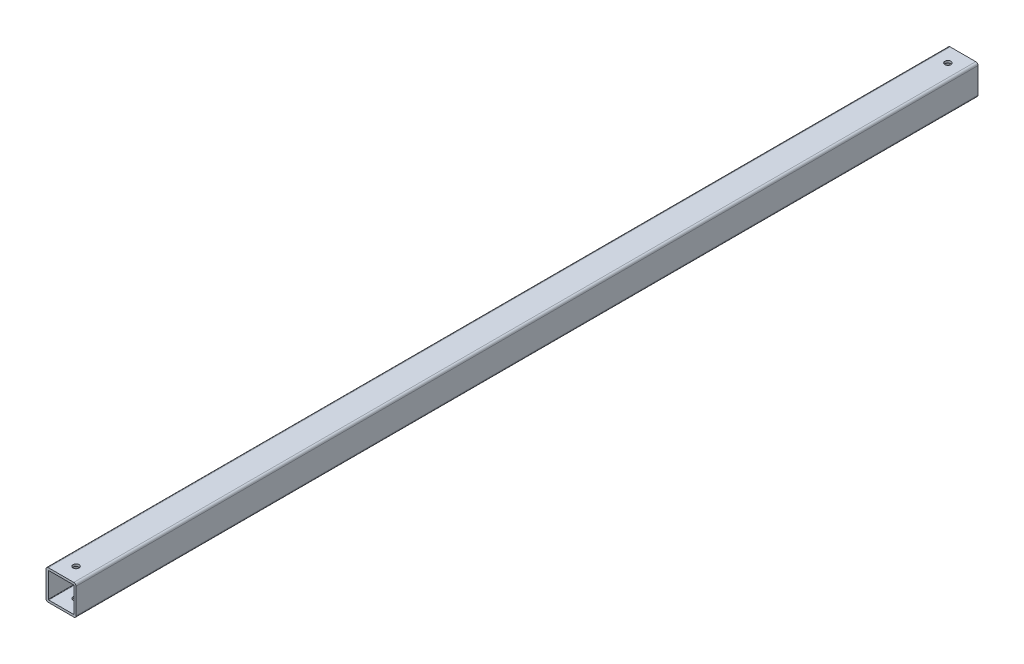
ISO-10303-21;
HEADER;
FILE_DESCRIPTION(('STEP AP214'),'2;1');
FILE_NAME('part.step','',(''),(''),'','','');
FILE_SCHEMA(('AUTOMOTIVE_DESIGN { 1 0 10303 214 1 1 1 1 }'));
ENDSEC;
DATA;
#1=APPLICATION_CONTEXT('core data for automotive mechanical design processes');
#2=APPLICATION_PROTOCOL_DEFINITION('international standard','automotive_design',2000,#1);
#3=PRODUCT_CONTEXT('',#1,'mechanical');
#4=PRODUCT('Part','Part','',(#3));
#5=PRODUCT_RELATED_PRODUCT_CATEGORY('part','',(#4));
#6=PRODUCT_DEFINITION_FORMATION('','',#4);
#7=PRODUCT_DEFINITION_CONTEXT('part definition',#1,'design');
#8=PRODUCT_DEFINITION('design','',#6,#7);
#9=PRODUCT_DEFINITION_SHAPE('','',#8);
#10=(LENGTH_UNIT() NAMED_UNIT(*) SI_UNIT(.MILLI.,.METRE.));
#11=(NAMED_UNIT(*) PLANE_ANGLE_UNIT() SI_UNIT($,.RADIAN.));
#12=(NAMED_UNIT(*) SI_UNIT($,.STERADIAN.) SOLID_ANGLE_UNIT());
#13=UNCERTAINTY_MEASURE_WITH_UNIT(LENGTH_MEASURE(1.E-05),#10,'distance_accuracy_value','');
#14=(GEOMETRIC_REPRESENTATION_CONTEXT(3) GLOBAL_UNCERTAINTY_ASSIGNED_CONTEXT((#13)) GLOBAL_UNIT_ASSIGNED_CONTEXT((#10,
#11,#12)) REPRESENTATION_CONTEXT('',''));
#15=CARTESIAN_POINT('',(0.,0.,0.));
#16=DIRECTION('',(0.,0.,1.));
#17=DIRECTION('',(1.,0.,0.));
#18=AXIS2_PLACEMENT_3D('',#15,#16,#17);
#19=CARTESIAN_POINT('',(0.,0.,1200.));
#20=DIRECTION('',(0.,0.,1.));
#21=DIRECTION('',(1.,0.,0.));
#22=AXIS2_PLACEMENT_3D('',#19,#20,#21);
#23=PLANE('',#22);
#24=DIRECTION('',(1.,0.,0.));
#25=VECTOR('',#24,1.);
#26=CARTESIAN_POINT('',(-20.,-20.,1200.));
#27=LINE('',#26,#25);
#28=CARTESIAN_POINT('',(-17.,-20.,1200.));
#29=VERTEX_POINT('',#28);
#30=CARTESIAN_POINT('',(17.,-20.,1200.));
#31=VERTEX_POINT('',#30);
#32=EDGE_CURVE('E199',#29,#31,#27,.T.);
#33=ORIENTED_EDGE('',*,*,#32,.T.);
#34=CARTESIAN_POINT('',(17.,-17.,1200.));
#35=DIRECTION('',(0.,0.,1.));
#36=DIRECTION('',(1.,0.,0.));
#37=AXIS2_PLACEMENT_3D('',#34,#35,#36);
#38=CIRCLE('',#37,3.);
#39=CARTESIAN_POINT('',(20.,-17.,1200.));
#40=VERTEX_POINT('',#39);
#41=EDGE_CURVE('E258',#31,#40,#38,.T.);
#42=ORIENTED_EDGE('',*,*,#41,.T.);
#43=DIRECTION('',(0.,1.,0.));
#44=VECTOR('',#43,1.);
#45=CARTESIAN_POINT('',(20.,20.,1200.));
#46=LINE('',#45,#44);
#47=CARTESIAN_POINT('',(20.,17.,1200.));
#48=VERTEX_POINT('',#47);
#49=EDGE_CURVE('E299',#40,#48,#46,.T.);
#50=ORIENTED_EDGE('',*,*,#49,.T.);
#51=CARTESIAN_POINT('',(17.,17.,1200.));
#52=DIRECTION('',(0.,0.,1.));
#53=DIRECTION('',(1.,0.,0.));
#54=AXIS2_PLACEMENT_3D('',#51,#52,#53);
#55=CIRCLE('',#54,3.);
#56=CARTESIAN_POINT('',(17.,20.,1200.));
#57=VERTEX_POINT('',#56);
#58=EDGE_CURVE('E254',#48,#57,#55,.T.);
#59=ORIENTED_EDGE('',*,*,#58,.T.);
#60=DIRECTION('',(-1.,0.,0.));
#61=VECTOR('',#60,1.);
#62=CARTESIAN_POINT('',(-20.,20.,1200.));
#63=LINE('',#62,#61);
#64=CARTESIAN_POINT('',(-17.,20.,1200.));
#65=VERTEX_POINT('',#64);
#66=EDGE_CURVE('E302',#57,#65,#63,.T.);
#67=ORIENTED_EDGE('',*,*,#66,.T.);
#68=CARTESIAN_POINT('',(-17.,17.,1200.));
#69=DIRECTION('',(0.,0.,1.));
#70=DIRECTION('',(1.,0.,0.));
#71=AXIS2_PLACEMENT_3D('',#68,#69,#70);
#72=CIRCLE('',#71,3.);
#73=CARTESIAN_POINT('',(-20.,17.,1200.));
#74=VERTEX_POINT('',#73);
#75=EDGE_CURVE('E80',#65,#74,#72,.T.);
#76=ORIENTED_EDGE('',*,*,#75,.T.);
#77=DIRECTION('',(0.,-1.,0.));
#78=VECTOR('',#77,1.);
#79=CARTESIAN_POINT('',(-20.,20.,1200.));
#80=LINE('',#79,#78);
#81=CARTESIAN_POINT('',(-20.,-17.,1200.));
#82=VERTEX_POINT('',#81);
#83=EDGE_CURVE('E204',#74,#82,#80,.T.);
#84=ORIENTED_EDGE('',*,*,#83,.T.);
#85=CARTESIAN_POINT('',(-17.,-17.,1200.));
#86=DIRECTION('',(0.,0.,1.));
#87=DIRECTION('',(1.,0.,0.));
#88=AXIS2_PLACEMENT_3D('',#85,#86,#87);
#89=CIRCLE('',#88,3.);
#90=EDGE_CURVE('E256',#82,#29,#89,.T.);
#91=ORIENTED_EDGE('',*,*,#90,.T.);
#92=EDGE_LOOP('',(#33,#42,#50,#59,#67,#76,#84,#91));
#93=FACE_BOUND('',#92,.T.);
#94=DIRECTION('',(-1.,0.,0.));
#95=VECTOR('',#94,1.);
#96=CARTESIAN_POINT('',(-20.,17.,1200.));
#97=LINE('',#96,#95);
#98=CARTESIAN_POINT('',(16.5,17.,1200.));
#99=VERTEX_POINT('',#98);
#100=CARTESIAN_POINT('',(-16.5,17.,1200.));
#101=VERTEX_POINT('',#100);
#102=EDGE_CURVE('E286',#99,#101,#97,.T.);
#103=ORIENTED_EDGE('',*,*,#102,.F.);
#104=CARTESIAN_POINT('',(16.5,16.5,1200.));
#105=DIRECTION('',(0.,0.,1.));
#106=DIRECTION('',(1.,0.,0.));
#107=AXIS2_PLACEMENT_3D('',#104,#105,#106);
#108=CIRCLE('',#107,0.5);
#109=CARTESIAN_POINT('',(17.,16.5,1200.));
#110=VERTEX_POINT('',#109);
#111=EDGE_CURVE('E229',#99,#110,#108,.F.);
#112=ORIENTED_EDGE('',*,*,#111,.T.);
#113=DIRECTION('',(0.,1.,0.));
#114=VECTOR('',#113,1.);
#115=CARTESIAN_POINT('',(17.,20.,1200.));
#116=LINE('',#115,#114);
#117=CARTESIAN_POINT('',(17.,-16.5,1200.));
#118=VERTEX_POINT('',#117);
#119=EDGE_CURVE('E283',#118,#110,#116,.T.);
#120=ORIENTED_EDGE('',*,*,#119,.F.);
#121=CARTESIAN_POINT('',(16.5,-16.5,1200.));
#122=DIRECTION('',(0.,0.,1.));
#123=DIRECTION('',(1.,0.,0.));
#124=AXIS2_PLACEMENT_3D('',#121,#122,#123);
#125=CIRCLE('',#124,0.5);
#126=CARTESIAN_POINT('',(16.5,-17.,1200.));
#127=VERTEX_POINT('',#126);
#128=EDGE_CURVE('E233',#118,#127,#125,.F.);
#129=ORIENTED_EDGE('',*,*,#128,.T.);
#130=DIRECTION('',(1.,0.,0.));
#131=VECTOR('',#130,1.);
#132=CARTESIAN_POINT('',(-20.,-17.,1200.));
#133=LINE('',#132,#131);
#134=CARTESIAN_POINT('',(-16.5,-17.,1200.));
#135=VERTEX_POINT('',#134);
#136=EDGE_CURVE('E291',#135,#127,#133,.T.);
#137=ORIENTED_EDGE('',*,*,#136,.F.);
#138=CARTESIAN_POINT('',(-16.5,-16.5,1200.));
#139=DIRECTION('',(0.,0.,1.));
#140=DIRECTION('',(1.,0.,0.));
#141=AXIS2_PLACEMENT_3D('',#138,#139,#140);
#142=CIRCLE('',#141,0.5);
#143=CARTESIAN_POINT('',(-17.,-16.5,1200.));
#144=VERTEX_POINT('',#143);
#145=EDGE_CURVE('E185',#135,#144,#142,.F.);
#146=ORIENTED_EDGE('',*,*,#145,.T.);
#147=DIRECTION('',(0.,-1.,0.));
#148=VECTOR('',#147,1.);
#149=CARTESIAN_POINT('',(-17.,20.,1200.));
#150=LINE('',#149,#148);
#151=CARTESIAN_POINT('',(-17.,16.5,1200.));
#152=VERTEX_POINT('',#151);
#153=EDGE_CURVE('E289',#152,#144,#150,.T.);
#154=ORIENTED_EDGE('',*,*,#153,.F.);
#155=CARTESIAN_POINT('',(-16.5,16.5,1200.));
#156=DIRECTION('',(0.,0.,1.));
#157=DIRECTION('',(1.,0.,0.));
#158=AXIS2_PLACEMENT_3D('',#155,#156,#157);
#159=CIRCLE('',#158,0.5);
#160=EDGE_CURVE('E184',#152,#101,#159,.F.);
#161=ORIENTED_EDGE('',*,*,#160,.T.);
#162=EDGE_LOOP('',(#103,#112,#120,#129,#137,#146,#154,#161));
#163=FACE_BOUND('',#162,.T.);
#164=ADVANCED_FACE('F56',(#93,#163),#23,.T.);
#165=CARTESIAN_POINT('',(0.,0.,0.));
#166=DIRECTION('',(0.,0.,1.));
#167=DIRECTION('',(1.,0.,0.));
#168=AXIS2_PLACEMENT_3D('',#165,#166,#167);
#169=PLANE('',#168);
#170=DIRECTION('',(0.,1.,0.));
#171=VECTOR('',#170,1.);
#172=CARTESIAN_POINT('',(20.,20.,0.));
#173=LINE('',#172,#171);
#174=CARTESIAN_POINT('',(20.,-17.,0.));
#175=VERTEX_POINT('',#174);
#176=CARTESIAN_POINT('',(20.,17.,0.));
#177=VERTEX_POINT('',#176);
#178=EDGE_CURVE('E294',#175,#177,#173,.T.);
#179=ORIENTED_EDGE('',*,*,#178,.F.);
#180=CARTESIAN_POINT('',(17.,-17.,0.));
#181=DIRECTION('',(0.,0.,1.));
#182=DIRECTION('',(1.,0.,0.));
#183=AXIS2_PLACEMENT_3D('',#180,#181,#182);
#184=CIRCLE('',#183,3.);
#185=CARTESIAN_POINT('',(17.,-20.,0.));
#186=VERTEX_POINT('',#185);
#187=EDGE_CURVE('E246',#175,#186,#184,.F.);
#188=ORIENTED_EDGE('',*,*,#187,.T.);
#189=DIRECTION('',(1.,0.,0.));
#190=VECTOR('',#189,1.);
#191=CARTESIAN_POINT('',(-20.,-20.,0.));
#192=LINE('',#191,#190);
#193=CARTESIAN_POINT('',(-17.,-20.,0.));
#194=VERTEX_POINT('',#193);
#195=EDGE_CURVE('E207',#194,#186,#192,.T.);
#196=ORIENTED_EDGE('',*,*,#195,.F.);
#197=CARTESIAN_POINT('',(-17.,-17.,0.));
#198=DIRECTION('',(0.,0.,1.));
#199=DIRECTION('',(1.,0.,0.));
#200=AXIS2_PLACEMENT_3D('',#197,#198,#199);
#201=CIRCLE('',#200,3.);
#202=CARTESIAN_POINT('',(-20.,-17.,0.));
#203=VERTEX_POINT('',#202);
#204=EDGE_CURVE('E244',#194,#203,#201,.F.);
#205=ORIENTED_EDGE('',*,*,#204,.T.);
#206=DIRECTION('',(0.,-1.,0.));
#207=VECTOR('',#206,1.);
#208=CARTESIAN_POINT('',(-20.,20.,0.));
#209=LINE('',#208,#207);
#210=CARTESIAN_POINT('',(-20.,17.,0.));
#211=VERTEX_POINT('',#210);
#212=EDGE_CURVE('E309',#211,#203,#209,.T.);
#213=ORIENTED_EDGE('',*,*,#212,.F.);
#214=CARTESIAN_POINT('',(-17.,17.,0.));
#215=DIRECTION('',(0.,0.,1.));
#216=DIRECTION('',(1.,0.,0.));
#217=AXIS2_PLACEMENT_3D('',#214,#215,#216);
#218=CIRCLE('',#217,3.);
#219=CARTESIAN_POINT('',(-17.,20.,0.));
#220=VERTEX_POINT('',#219);
#221=EDGE_CURVE('E240',#211,#220,#218,.F.);
#222=ORIENTED_EDGE('',*,*,#221,.T.);
#223=DIRECTION('',(-1.,0.,0.));
#224=VECTOR('',#223,1.);
#225=CARTESIAN_POINT('',(-20.,20.,0.));
#226=LINE('',#225,#224);
#227=CARTESIAN_POINT('',(17.,20.,0.));
#228=VERTEX_POINT('',#227);
#229=EDGE_CURVE('E307',#228,#220,#226,.T.);
#230=ORIENTED_EDGE('',*,*,#229,.F.);
#231=CARTESIAN_POINT('',(17.,17.,0.));
#232=DIRECTION('',(0.,0.,1.));
#233=DIRECTION('',(1.,0.,0.));
#234=AXIS2_PLACEMENT_3D('',#231,#232,#233);
#235=CIRCLE('',#234,3.);
#236=EDGE_CURVE('E242',#228,#177,#235,.F.);
#237=ORIENTED_EDGE('',*,*,#236,.T.);
#238=EDGE_LOOP('',(#179,#188,#196,#205,#213,#222,#230,#237));
#239=FACE_BOUND('',#238,.T.);
#240=DIRECTION('',(1.,0.,0.));
#241=VECTOR('',#240,1.);
#242=CARTESIAN_POINT('',(-20.,-17.,0.));
#243=LINE('',#242,#241);
#244=CARTESIAN_POINT('',(-16.5,-17.,0.));
#245=VERTEX_POINT('',#244);
#246=CARTESIAN_POINT('',(16.5,-17.,0.));
#247=VERTEX_POINT('',#246);
#248=EDGE_CURVE('E195',#245,#247,#243,.T.);
#249=ORIENTED_EDGE('',*,*,#248,.T.);
#250=CARTESIAN_POINT('',(16.5,-16.5,0.));
#251=DIRECTION('',(0.,0.,1.));
#252=DIRECTION('',(1.,0.,0.));
#253=AXIS2_PLACEMENT_3D('',#250,#251,#252);
#254=CIRCLE('',#253,0.5);
#255=CARTESIAN_POINT('',(17.,-16.5,0.));
#256=VERTEX_POINT('',#255);
#257=EDGE_CURVE('E231',#247,#256,#254,.T.);
#258=ORIENTED_EDGE('',*,*,#257,.T.);
#259=DIRECTION('',(0.,1.,0.));
#260=VECTOR('',#259,1.);
#261=CARTESIAN_POINT('',(17.,20.,0.));
#262=LINE('',#261,#260);
#263=CARTESIAN_POINT('',(17.,16.5,0.));
#264=VERTEX_POINT('',#263);
#265=EDGE_CURVE('E271',#256,#264,#262,.T.);
#266=ORIENTED_EDGE('',*,*,#265,.T.);
#267=CARTESIAN_POINT('',(16.5,16.5,0.));
#268=DIRECTION('',(0.,0.,1.));
#269=DIRECTION('',(1.,0.,0.));
#270=AXIS2_PLACEMENT_3D('',#267,#268,#269);
#271=CIRCLE('',#270,0.5);
#272=CARTESIAN_POINT('',(16.5,17.,0.));
#273=VERTEX_POINT('',#272);
#274=EDGE_CURVE('E227',#264,#273,#271,.T.);
#275=ORIENTED_EDGE('',*,*,#274,.T.);
#276=DIRECTION('',(-1.,0.,0.));
#277=VECTOR('',#276,1.);
#278=CARTESIAN_POINT('',(-20.,17.,0.));
#279=LINE('',#278,#277);
#280=CARTESIAN_POINT('',(-16.5,17.,0.));
#281=VERTEX_POINT('',#280);
#282=EDGE_CURVE('E179',#273,#281,#279,.T.);
#283=ORIENTED_EDGE('',*,*,#282,.T.);
#284=CARTESIAN_POINT('',(-16.5,16.5,0.));
#285=DIRECTION('',(0.,0.,1.));
#286=DIRECTION('',(1.,0.,0.));
#287=AXIS2_PLACEMENT_3D('',#284,#285,#286);
#288=CIRCLE('',#287,0.5);
#289=CARTESIAN_POINT('',(-17.,16.5,0.));
#290=VERTEX_POINT('',#289);
#291=EDGE_CURVE('E173',#281,#290,#288,.T.);
#292=ORIENTED_EDGE('',*,*,#291,.T.);
#293=DIRECTION('',(0.,-1.,0.));
#294=VECTOR('',#293,1.);
#295=CARTESIAN_POINT('',(-17.,20.,0.));
#296=LINE('',#295,#294);
#297=CARTESIAN_POINT('',(-17.,-16.5,0.));
#298=VERTEX_POINT('',#297);
#299=EDGE_CURVE('E177',#290,#298,#296,.T.);
#300=ORIENTED_EDGE('',*,*,#299,.T.);
#301=CARTESIAN_POINT('',(-16.5,-16.5,0.));
#302=DIRECTION('',(0.,0.,1.));
#303=DIRECTION('',(1.,0.,0.));
#304=AXIS2_PLACEMENT_3D('',#301,#302,#303);
#305=CIRCLE('',#304,0.5);
#306=EDGE_CURVE('E223',#298,#245,#305,.T.);
#307=ORIENTED_EDGE('',*,*,#306,.T.);
#308=EDGE_LOOP('',(#249,#258,#266,#275,#283,#292,#300,#307));
#309=FACE_BOUND('',#308,.T.);
#310=ADVANCED_FACE('F176',(#239,#309),#169,.F.);
#311=CARTESIAN_POINT('',(20.,20.,1200.));
#312=DIRECTION('',(-1.,0.,0.));
#313=DIRECTION('',(0.,-1.,0.));
#314=AXIS2_PLACEMENT_3D('',#311,#312,#313);
#315=PLANE('',#314);
#316=ORIENTED_EDGE('',*,*,#49,.F.);
#317=DIRECTION('',(0.,0.,-1.));
#318=VECTOR('',#317,1.);
#319=CARTESIAN_POINT('',(20.,-17.,1200.));
#320=LINE('',#319,#318);
#321=EDGE_CURVE('E237',#40,#175,#320,.T.);
#322=ORIENTED_EDGE('',*,*,#321,.T.);
#323=ORIENTED_EDGE('',*,*,#178,.T.);
#324=DIRECTION('',(0.,0.,-1.));
#325=VECTOR('',#324,1.);
#326=CARTESIAN_POINT('',(20.,17.,1200.));
#327=LINE('',#326,#325);
#328=EDGE_CURVE('E235',#177,#48,#327,.F.);
#329=ORIENTED_EDGE('',*,*,#328,.T.);
#330=EDGE_LOOP('',(#316,#322,#323,#329));
#331=FACE_BOUND('',#330,.T.);
#332=ADVANCED_FACE('F327',(#331),#315,.F.);
#333=CARTESIAN_POINT('',(-20.,20.,1200.));
#334=DIRECTION('',(0.,-1.,0.));
#335=DIRECTION('',(0.,0.,-1.));
#336=AXIS2_PLACEMENT_3D('',#333,#334,#335);
#337=PLANE('',#336);
#338=CARTESIAN_POINT('',(0.,20.,1180.));
#339=DIRECTION('',(0.,1.,0.));
#340=DIRECTION('',(0.,0.,1.));
#341=AXIS2_PLACEMENT_3D('',#338,#339,#340);
#342=CIRCLE('',#341,3.99999999999999);
#343=CARTESIAN_POINT('',(0.,20.,1184.));
#344=VERTEX_POINT('',#343);
#345=EDGE_CURVE('E439',#344,#344,#342,.T.);
#346=ORIENTED_EDGE('',*,*,#345,.F.);
#347=EDGE_LOOP('',(#346));
#348=FACE_BOUND('',#347,.T.);
#349=CARTESIAN_POINT('',(0.,20.,20.));
#350=DIRECTION('',(0.,1.,0.));
#351=DIRECTION('',(0.,0.,1.));
#352=AXIS2_PLACEMENT_3D('',#349,#350,#351);
#353=CIRCLE('',#352,3.99999999999999);
#354=CARTESIAN_POINT('',(0.,20.,24.));
#355=VERTEX_POINT('',#354);
#356=EDGE_CURVE('E274',#355,#355,#353,.T.);
#357=ORIENTED_EDGE('',*,*,#356,.F.);
#358=EDGE_LOOP('',(#357));
#359=FACE_BOUND('',#358,.T.);
#360=ORIENTED_EDGE('',*,*,#66,.F.);
#361=DIRECTION('',(0.,0.,-1.));
#362=VECTOR('',#361,1.);
#363=CARTESIAN_POINT('',(17.,20.,1200.));
#364=LINE('',#363,#362);
#365=EDGE_CURVE('E12',#57,#228,#364,.T.);
#366=ORIENTED_EDGE('',*,*,#365,.T.);
#367=ORIENTED_EDGE('',*,*,#229,.T.);
#368=DIRECTION('',(0.,0.,-1.));
#369=VECTOR('',#368,1.);
#370=CARTESIAN_POINT('',(-17.,20.,1200.));
#371=LINE('',#370,#369);
#372=EDGE_CURVE('E65',#220,#65,#371,.F.);
#373=ORIENTED_EDGE('',*,*,#372,.T.);
#374=EDGE_LOOP('',(#360,#366,#367,#373));
#375=FACE_BOUND('',#374,.T.);
#376=ADVANCED_FACE('F335',(#348,#359,#375),#337,.F.);
#377=CARTESIAN_POINT('',(-20.,20.,1200.));
#378=DIRECTION('',(1.,0.,0.));
#379=DIRECTION('',(0.,1.,0.));
#380=AXIS2_PLACEMENT_3D('',#377,#378,#379);
#381=PLANE('',#380);
#382=ORIENTED_EDGE('',*,*,#212,.T.);
#383=DIRECTION('',(0.,0.,-1.));
#384=VECTOR('',#383,1.);
#385=CARTESIAN_POINT('',(-20.,-17.,1200.));
#386=LINE('',#385,#384);
#387=EDGE_CURVE('E73',#203,#82,#386,.F.);
#388=ORIENTED_EDGE('',*,*,#387,.T.);
#389=ORIENTED_EDGE('',*,*,#83,.F.);
#390=DIRECTION('',(0.,0.,-1.));
#391=VECTOR('',#390,1.);
#392=CARTESIAN_POINT('',(-20.,17.,1200.));
#393=LINE('',#392,#391);
#394=EDGE_CURVE('E260',#74,#211,#393,.T.);
#395=ORIENTED_EDGE('',*,*,#394,.T.);
#396=EDGE_LOOP('',(#382,#388,#389,#395));
#397=FACE_BOUND('',#396,.T.);
#398=ADVANCED_FACE('F340',(#397),#381,.F.);
#399=CARTESIAN_POINT('',(-20.,-20.,1200.));
#400=DIRECTION('',(0.,1.,0.));
#401=DIRECTION('',(0.,0.,1.));
#402=AXIS2_PLACEMENT_3D('',#399,#400,#401);
#403=PLANE('',#402);
#404=CARTESIAN_POINT('',(0.,-20.,1180.));
#405=DIRECTION('',(0.,1.,0.));
#406=DIRECTION('',(0.,0.,1.));
#407=AXIS2_PLACEMENT_3D('',#404,#405,#406);
#408=CIRCLE('',#407,3.99999999999999);
#409=CARTESIAN_POINT('',(0.,-20.,1184.));
#410=VERTEX_POINT('',#409);
#411=EDGE_CURVE('E438',#410,#410,#408,.T.);
#412=ORIENTED_EDGE('',*,*,#411,.T.);
#413=EDGE_LOOP('',(#412));
#414=FACE_BOUND('',#413,.T.);
#415=CARTESIAN_POINT('',(0.,-20.,20.));
#416=DIRECTION('',(0.,1.,0.));
#417=DIRECTION('',(0.,0.,1.));
#418=AXIS2_PLACEMENT_3D('',#415,#416,#417);
#419=CIRCLE('',#418,3.99999999999999);
#420=CARTESIAN_POINT('',(0.,-20.,24.));
#421=VERTEX_POINT('',#420);
#422=EDGE_CURVE('E267',#421,#421,#419,.T.);
#423=ORIENTED_EDGE('',*,*,#422,.T.);
#424=EDGE_LOOP('',(#423));
#425=FACE_BOUND('',#424,.T.);
#426=ORIENTED_EDGE('',*,*,#195,.T.);
#427=DIRECTION('',(0.,0.,-1.));
#428=VECTOR('',#427,1.);
#429=CARTESIAN_POINT('',(17.,-20.,1200.));
#430=LINE('',#429,#428);
#431=EDGE_CURVE('E251',#186,#31,#430,.F.);
#432=ORIENTED_EDGE('',*,*,#431,.T.);
#433=ORIENTED_EDGE('',*,*,#32,.F.);
#434=DIRECTION('',(0.,0.,-1.));
#435=VECTOR('',#434,1.);
#436=CARTESIAN_POINT('',(-17.,-20.,1200.));
#437=LINE('',#436,#435);
#438=EDGE_CURVE('E248',#29,#194,#437,.T.);
#439=ORIENTED_EDGE('',*,*,#438,.T.);
#440=EDGE_LOOP('',(#426,#432,#433,#439));
#441=FACE_BOUND('',#440,.T.);
#442=ADVANCED_FACE('F315',(#414,#425,#441),#403,.F.);
#443=CARTESIAN_POINT('',(17.,20.,1200.));
#444=DIRECTION('',(-1.,0.,0.));
#445=DIRECTION('',(0.,-1.,0.));
#446=AXIS2_PLACEMENT_3D('',#443,#444,#445);
#447=PLANE('',#446);
#448=ORIENTED_EDGE('',*,*,#119,.T.);
#449=DIRECTION('',(0.,0.,-1.));
#450=VECTOR('',#449,1.);
#451=CARTESIAN_POINT('',(17.,16.5,0.));
#452=LINE('',#451,#450);
#453=EDGE_CURVE('E220',#110,#264,#452,.T.);
#454=ORIENTED_EDGE('',*,*,#453,.T.);
#455=ORIENTED_EDGE('',*,*,#265,.F.);
#456=DIRECTION('',(0.,0.,-1.));
#457=VECTOR('',#456,1.);
#458=CARTESIAN_POINT('',(17.,-16.5,1200.));
#459=LINE('',#458,#457);
#460=EDGE_CURVE('E218',#256,#118,#459,.F.);
#461=ORIENTED_EDGE('',*,*,#460,.T.);
#462=EDGE_LOOP('',(#448,#454,#455,#461));
#463=FACE_BOUND('',#462,.T.);
#464=ADVANCED_FACE('F359',(#463),#447,.T.);
#465=CARTESIAN_POINT('',(-20.,17.,1200.));
#466=DIRECTION('',(0.,-1.,0.));
#467=DIRECTION('',(0.,0.,-1.));
#468=AXIS2_PLACEMENT_3D('',#465,#466,#467);
#469=PLANE('',#468);
#470=CARTESIAN_POINT('',(0.,17.,1180.));
#471=DIRECTION('',(0.,-1.,0.));
#472=DIRECTION('',(0.,0.,-1.));
#473=AXIS2_PLACEMENT_3D('',#470,#471,#472);
#474=CIRCLE('',#473,3.99999999999999);
#475=CARTESIAN_POINT('',(0.,17.,1176.));
#476=VERTEX_POINT('',#475);
#477=EDGE_CURVE('E279',#476,#476,#474,.T.);
#478=ORIENTED_EDGE('',*,*,#477,.F.);
#479=EDGE_LOOP('',(#478));
#480=FACE_BOUND('',#479,.T.);
#481=CARTESIAN_POINT('',(0.,17.,20.));
#482=DIRECTION('',(0.,-1.,0.));
#483=DIRECTION('',(0.,0.,-1.));
#484=AXIS2_PLACEMENT_3D('',#481,#482,#483);
#485=CIRCLE('',#484,3.99999999999999);
#486=CARTESIAN_POINT('',(0.,17.,16.));
#487=VERTEX_POINT('',#486);
#488=EDGE_CURVE('E266',#487,#487,#485,.T.);
#489=ORIENTED_EDGE('',*,*,#488,.F.);
#490=EDGE_LOOP('',(#489));
#491=FACE_BOUND('',#490,.T.);
#492=ORIENTED_EDGE('',*,*,#102,.T.);
#493=DIRECTION('',(0.,0.,-1.));
#494=VECTOR('',#493,1.);
#495=CARTESIAN_POINT('',(-16.5,17.,0.));
#496=LINE('',#495,#494);
#497=EDGE_CURVE('E216',#101,#281,#496,.T.);
#498=ORIENTED_EDGE('',*,*,#497,.T.);
#499=ORIENTED_EDGE('',*,*,#282,.F.);
#500=DIRECTION('',(0.,0.,-1.));
#501=VECTOR('',#500,1.);
#502=CARTESIAN_POINT('',(16.5,17.,1200.));
#503=LINE('',#502,#501);
#504=EDGE_CURVE('E214',#273,#99,#503,.F.);
#505=ORIENTED_EDGE('',*,*,#504,.T.);
#506=EDGE_LOOP('',(#492,#498,#499,#505));
#507=FACE_BOUND('',#506,.T.);
#508=ADVANCED_FACE('F399',(#480,#491,#507),#469,.T.);
#509=CARTESIAN_POINT('',(-17.,20.,1200.));
#510=DIRECTION('',(1.,0.,0.));
#511=DIRECTION('',(0.,1.,0.));
#512=AXIS2_PLACEMENT_3D('',#509,#510,#511);
#513=PLANE('',#512);
#514=ORIENTED_EDGE('',*,*,#153,.T.);
#515=DIRECTION('',(0.,0.,-1.));
#516=VECTOR('',#515,1.);
#517=CARTESIAN_POINT('',(-17.,-16.5,0.));
#518=LINE('',#517,#516);
#519=EDGE_CURVE('E194',#144,#298,#518,.T.);
#520=ORIENTED_EDGE('',*,*,#519,.T.);
#521=ORIENTED_EDGE('',*,*,#299,.F.);
#522=DIRECTION('',(0.,0.,-1.));
#523=VECTOR('',#522,1.);
#524=CARTESIAN_POINT('',(-17.,16.5,1200.));
#525=LINE('',#524,#523);
#526=EDGE_CURVE('E191',#290,#152,#525,.F.);
#527=ORIENTED_EDGE('',*,*,#526,.T.);
#528=EDGE_LOOP('',(#514,#520,#521,#527));
#529=FACE_BOUND('',#528,.T.);
#530=ADVANCED_FACE('F190',(#529),#513,.T.);
#531=CARTESIAN_POINT('',(-20.,-17.,1200.));
#532=DIRECTION('',(0.,1.,0.));
#533=DIRECTION('',(0.,0.,1.));
#534=AXIS2_PLACEMENT_3D('',#531,#532,#533);
#535=PLANE('',#534);
#536=CARTESIAN_POINT('',(0.,-17.,1180.));
#537=DIRECTION('',(0.,1.,0.));
#538=DIRECTION('',(0.,0.,1.));
#539=AXIS2_PLACEMENT_3D('',#536,#537,#538);
#540=CIRCLE('',#539,3.99999999999999);
#541=CARTESIAN_POINT('',(0.,-17.,1184.));
#542=VERTEX_POINT('',#541);
#543=EDGE_CURVE('E60',#542,#542,#540,.T.);
#544=ORIENTED_EDGE('',*,*,#543,.F.);
#545=EDGE_LOOP('',(#544));
#546=FACE_BOUND('',#545,.T.);
#547=CARTESIAN_POINT('',(0.,-17.,20.));
#548=DIRECTION('',(0.,1.,0.));
#549=DIRECTION('',(0.,0.,1.));
#550=AXIS2_PLACEMENT_3D('',#547,#548,#549);
#551=CIRCLE('',#550,3.99999999999999);
#552=CARTESIAN_POINT('',(0.,-17.,24.));
#553=VERTEX_POINT('',#552);
#554=EDGE_CURVE('E264',#553,#553,#551,.T.);
#555=ORIENTED_EDGE('',*,*,#554,.F.);
#556=EDGE_LOOP('',(#555));
#557=FACE_BOUND('',#556,.T.);
#558=ORIENTED_EDGE('',*,*,#248,.F.);
#559=DIRECTION('',(0.,0.,-1.));
#560=VECTOR('',#559,1.);
#561=CARTESIAN_POINT('',(-16.5,-17.,1200.));
#562=LINE('',#561,#560);
#563=EDGE_CURVE('E212',#245,#135,#562,.F.);
#564=ORIENTED_EDGE('',*,*,#563,.T.);
#565=ORIENTED_EDGE('',*,*,#136,.T.);
#566=DIRECTION('',(0.,0.,-1.));
#567=VECTOR('',#566,1.);
#568=CARTESIAN_POINT('',(16.5,-17.,0.));
#569=LINE('',#568,#567);
#570=EDGE_CURVE('E201',#127,#247,#569,.T.);
#571=ORIENTED_EDGE('',*,*,#570,.T.);
#572=EDGE_LOOP('',(#558,#564,#565,#571));
#573=FACE_BOUND('',#572,.T.);
#574=ADVANCED_FACE('F375',(#546,#557,#573),#535,.T.);
#575=CARTESIAN_POINT('',(-16.5,-16.5,1200.));
#576=DIRECTION('',(0.,0.,1.));
#577=DIRECTION('',(1.,0.,0.));
#578=AXIS2_PLACEMENT_3D('',#575,#576,#577);
#579=CYLINDRICAL_SURFACE('',#578,0.5);
#580=ORIENTED_EDGE('',*,*,#145,.F.);
#581=ORIENTED_EDGE('',*,*,#563,.F.);
#582=ORIENTED_EDGE('',*,*,#306,.F.);
#583=ORIENTED_EDGE('',*,*,#519,.F.);
#584=EDGE_LOOP('',(#580,#581,#582,#583));
#585=FACE_BOUND('',#584,.T.);
#586=ADVANCED_FACE('F372',(#585),#579,.F.);
#587=CARTESIAN_POINT('',(-16.5,16.5,1200.));
#588=DIRECTION('',(0.,0.,1.));
#589=DIRECTION('',(1.,0.,0.));
#590=AXIS2_PLACEMENT_3D('',#587,#588,#589);
#591=CYLINDRICAL_SURFACE('',#590,0.5);
#592=ORIENTED_EDGE('',*,*,#160,.F.);
#593=ORIENTED_EDGE('',*,*,#526,.F.);
#594=ORIENTED_EDGE('',*,*,#291,.F.);
#595=ORIENTED_EDGE('',*,*,#497,.F.);
#596=EDGE_LOOP('',(#592,#593,#594,#595));
#597=FACE_BOUND('',#596,.T.);
#598=ADVANCED_FACE('F198',(#597),#591,.F.);
#599=CARTESIAN_POINT('',(16.5,16.5,1200.));
#600=DIRECTION('',(0.,0.,1.));
#601=DIRECTION('',(1.,0.,0.));
#602=AXIS2_PLACEMENT_3D('',#599,#600,#601);
#603=CYLINDRICAL_SURFACE('',#602,0.5);
#604=ORIENTED_EDGE('',*,*,#111,.F.);
#605=ORIENTED_EDGE('',*,*,#504,.F.);
#606=ORIENTED_EDGE('',*,*,#274,.F.);
#607=ORIENTED_EDGE('',*,*,#453,.F.);
#608=EDGE_LOOP('',(#604,#605,#606,#607));
#609=FACE_BOUND('',#608,.T.);
#610=ADVANCED_FACE('F379',(#609),#603,.F.);
#611=CARTESIAN_POINT('',(16.5,-16.5,1200.));
#612=DIRECTION('',(0.,0.,1.));
#613=DIRECTION('',(1.,0.,0.));
#614=AXIS2_PLACEMENT_3D('',#611,#612,#613);
#615=CYLINDRICAL_SURFACE('',#614,0.5);
#616=ORIENTED_EDGE('',*,*,#128,.F.);
#617=ORIENTED_EDGE('',*,*,#460,.F.);
#618=ORIENTED_EDGE('',*,*,#257,.F.);
#619=ORIENTED_EDGE('',*,*,#570,.F.);
#620=EDGE_LOOP('',(#616,#617,#618,#619));
#621=FACE_BOUND('',#620,.T.);
#622=ADVANCED_FACE('F350',(#621),#615,.F.);
#623=CARTESIAN_POINT('',(17.,-17.,1200.));
#624=DIRECTION('',(0.,0.,-1.));
#625=DIRECTION('',(-1.,0.,0.));
#626=AXIS2_PLACEMENT_3D('',#623,#624,#625);
#627=CYLINDRICAL_SURFACE('',#626,3.);
#628=ORIENTED_EDGE('',*,*,#41,.F.);
#629=ORIENTED_EDGE('',*,*,#431,.F.);
#630=ORIENTED_EDGE('',*,*,#187,.F.);
#631=ORIENTED_EDGE('',*,*,#321,.F.);
#632=EDGE_LOOP('',(#628,#629,#630,#631));
#633=FACE_BOUND('',#632,.T.);
#634=ADVANCED_FACE('F321',(#633),#627,.T.);
#635=CARTESIAN_POINT('',(-17.,-17.,1200.));
#636=DIRECTION('',(0.,0.,-1.));
#637=DIRECTION('',(-1.,0.,0.));
#638=AXIS2_PLACEMENT_3D('',#635,#636,#637);
#639=CYLINDRICAL_SURFACE('',#638,3.);
#640=ORIENTED_EDGE('',*,*,#90,.F.);
#641=ORIENTED_EDGE('',*,*,#387,.F.);
#642=ORIENTED_EDGE('',*,*,#204,.F.);
#643=ORIENTED_EDGE('',*,*,#438,.F.);
#644=EDGE_LOOP('',(#640,#641,#642,#643));
#645=FACE_BOUND('',#644,.T.);
#646=ADVANCED_FACE('F343',(#645),#639,.T.);
#647=CARTESIAN_POINT('',(17.,17.,1200.));
#648=DIRECTION('',(0.,0.,-1.));
#649=DIRECTION('',(-1.,0.,0.));
#650=AXIS2_PLACEMENT_3D('',#647,#648,#649);
#651=CYLINDRICAL_SURFACE('',#650,3.);
#652=ORIENTED_EDGE('',*,*,#58,.F.);
#653=ORIENTED_EDGE('',*,*,#328,.F.);
#654=ORIENTED_EDGE('',*,*,#236,.F.);
#655=ORIENTED_EDGE('',*,*,#365,.F.);
#656=EDGE_LOOP('',(#652,#653,#654,#655));
#657=FACE_BOUND('',#656,.T.);
#658=ADVANCED_FACE('F331',(#657),#651,.T.);
#659=CARTESIAN_POINT('',(-17.,17.,1200.));
#660=DIRECTION('',(0.,0.,-1.));
#661=DIRECTION('',(-1.,0.,0.));
#662=AXIS2_PLACEMENT_3D('',#659,#660,#661);
#663=CYLINDRICAL_SURFACE('',#662,3.);
#664=ORIENTED_EDGE('',*,*,#75,.F.);
#665=ORIENTED_EDGE('',*,*,#372,.F.);
#666=ORIENTED_EDGE('',*,*,#221,.F.);
#667=ORIENTED_EDGE('',*,*,#394,.F.);
#668=EDGE_LOOP('',(#664,#665,#666,#667));
#669=FACE_BOUND('',#668,.T.);
#670=ADVANCED_FACE('F58',(#669),#663,.T.);
#671=CARTESIAN_POINT('',(0.,20.,20.));
#672=DIRECTION('',(0.,1.,0.));
#673=DIRECTION('',(0.,0.,1.));
#674=AXIS2_PLACEMENT_3D('',#671,#672,#673);
#675=CYLINDRICAL_SURFACE('',#674,3.99999999999999);
#676=ORIENTED_EDGE('',*,*,#554,.T.);
#677=EDGE_LOOP('',(#676));
#678=FACE_BOUND('',#677,.T.);
#679=ORIENTED_EDGE('',*,*,#422,.F.);
#680=EDGE_LOOP('',(#679));
#681=FACE_BOUND('',#680,.T.);
#682=ADVANCED_FACE('F419',(#678,#681),#675,.F.);
#683=ORIENTED_EDGE('',*,*,#488,.T.);
#684=EDGE_LOOP('',(#683));
#685=FACE_BOUND('',#684,.T.);
#686=ORIENTED_EDGE('',*,*,#356,.T.);
#687=EDGE_LOOP('',(#686));
#688=FACE_BOUND('',#687,.T.);
#689=ADVANCED_FACE('F422',(#685,#688),#675,.F.);
#690=CARTESIAN_POINT('',(0.,20.,1180.));
#691=DIRECTION('',(0.,1.,0.));
#692=DIRECTION('',(0.,0.,1.));
#693=AXIS2_PLACEMENT_3D('',#690,#691,#692);
#694=CYLINDRICAL_SURFACE('',#693,3.99999999999999);
#695=ORIENTED_EDGE('',*,*,#543,.T.);
#696=EDGE_LOOP('',(#695));
#697=FACE_BOUND('',#696,.T.);
#698=ORIENTED_EDGE('',*,*,#411,.F.);
#699=EDGE_LOOP('',(#698));
#700=FACE_BOUND('',#699,.T.);
#701=ADVANCED_FACE('F423',(#697,#700),#694,.F.);
#702=ORIENTED_EDGE('',*,*,#477,.T.);
#703=EDGE_LOOP('',(#702));
#704=FACE_BOUND('',#703,.T.);
#705=ORIENTED_EDGE('',*,*,#345,.T.);
#706=EDGE_LOOP('',(#705));
#707=FACE_BOUND('',#706,.T.);
#708=ADVANCED_FACE('F425',(#704,#707),#694,.F.);
#709=CLOSED_SHELL('',(#164,#310,#332,#376,#398,#442,#464,#508,#530,#574,#586,#598,#610,#622,
#634,#646,#658,#670,#682,#689,#701,#708));
#710=MANIFOLD_SOLID_BREP('B2',#709);
#711=ADVANCED_BREP_SHAPE_REPRESENTATION('',(#18,#710),#14);
#712=SHAPE_DEFINITION_REPRESENTATION(#9,#711);
ENDSEC;
END-ISO-10303-21;
